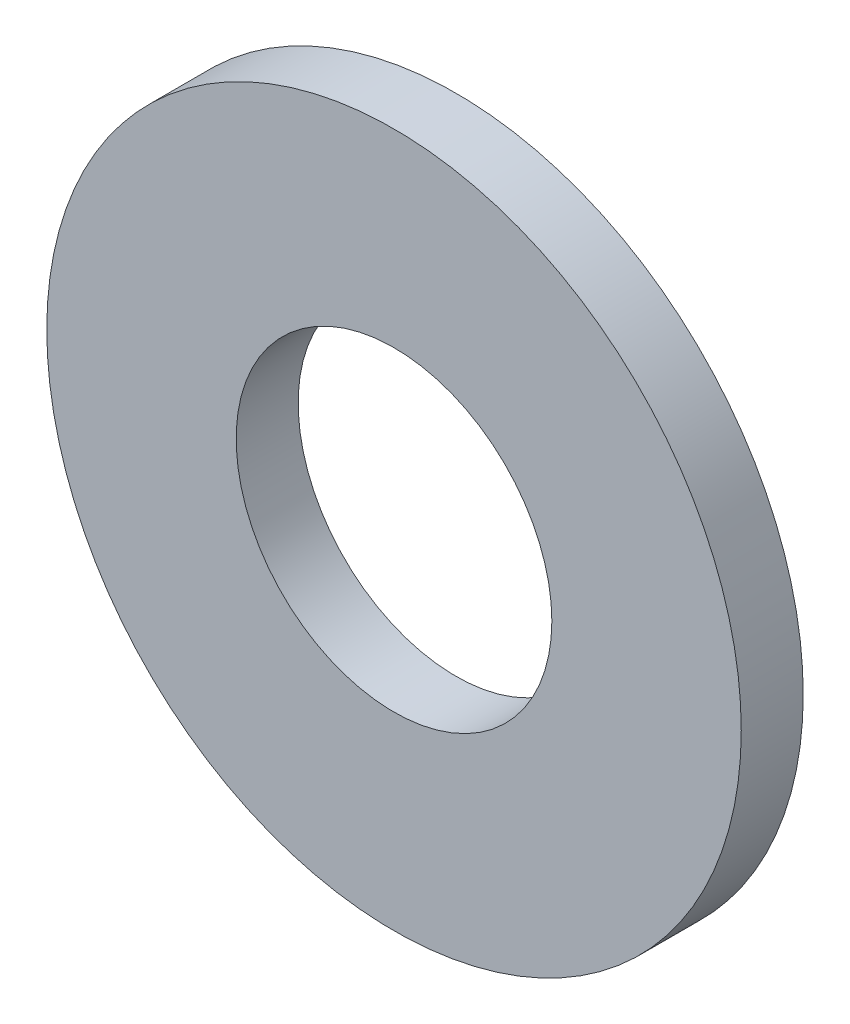
ISO-10303-21;
HEADER;
FILE_DESCRIPTION(('STEP AP214'),'2;1');
FILE_NAME('part.step','',(''),(''),'','','');
FILE_SCHEMA(('AUTOMOTIVE_DESIGN { 1 0 10303 214 1 1 1 1 }'));
ENDSEC;
DATA;
#1=APPLICATION_CONTEXT('core data for automotive mechanical design processes');
#2=APPLICATION_PROTOCOL_DEFINITION('international standard','automotive_design',2000,#1);
#3=PRODUCT_CONTEXT('',#1,'mechanical');
#4=PRODUCT('Part','Part','',(#3));
#5=PRODUCT_RELATED_PRODUCT_CATEGORY('part','',(#4));
#6=PRODUCT_DEFINITION_FORMATION('','',#4);
#7=PRODUCT_DEFINITION_CONTEXT('part definition',#1,'design');
#8=PRODUCT_DEFINITION('design','',#6,#7);
#9=PRODUCT_DEFINITION_SHAPE('','',#8);
#10=(LENGTH_UNIT() NAMED_UNIT(*) SI_UNIT(.MILLI.,.METRE.));
#11=(NAMED_UNIT(*) PLANE_ANGLE_UNIT() SI_UNIT($,.RADIAN.));
#12=(NAMED_UNIT(*) SI_UNIT($,.STERADIAN.) SOLID_ANGLE_UNIT());
#13=UNCERTAINTY_MEASURE_WITH_UNIT(LENGTH_MEASURE(1.E-05),#10,'distance_accuracy_value','');
#14=(GEOMETRIC_REPRESENTATION_CONTEXT(3) GLOBAL_UNCERTAINTY_ASSIGNED_CONTEXT((#13)) GLOBAL_UNIT_ASSIGNED_CONTEXT((#10,
#11,#12)) REPRESENTATION_CONTEXT('',''));
#15=CARTESIAN_POINT('',(0.,0.,0.));
#16=DIRECTION('',(0.,0.,1.));
#17=DIRECTION('',(1.,0.,0.));
#18=AXIS2_PLACEMENT_3D('',#15,#16,#17);
#19=CARTESIAN_POINT('',(0.,0.,4.7371));
#20=DIRECTION('',(0.,0.,1.));
#21=DIRECTION('',(1.,0.,0.));
#22=AXIS2_PLACEMENT_3D('',#19,#20,#21);
#23=PLANE('',#22);
#24=CARTESIAN_POINT('',(0.,0.,4.7371));
#25=DIRECTION('',(0.,0.,1.));
#26=DIRECTION('',(1.,0.,0.));
#27=AXIS2_PLACEMENT_3D('',#24,#25,#26);
#28=CIRCLE('',#27,26.543);
#29=CARTESIAN_POINT('',(26.543,0.,4.7371));
#30=VERTEX_POINT('',#29);
#31=EDGE_CURVE('E11',#30,#30,#28,.T.);
#32=ORIENTED_EDGE('',*,*,#31,.T.);
#33=EDGE_LOOP('',(#32));
#34=FACE_BOUND('',#33,.T.);
#35=CARTESIAN_POINT('',(0.,0.,4.7371));
#36=DIRECTION('',(0.,0.,1.));
#37=DIRECTION('',(1.,0.,0.));
#38=AXIS2_PLACEMENT_3D('',#35,#36,#37);
#39=CIRCLE('',#38,12.065);
#40=CARTESIAN_POINT('',(12.065,0.,4.7371));
#41=VERTEX_POINT('',#40);
#42=EDGE_CURVE('E60',#41,#41,#39,.T.);
#43=ORIENTED_EDGE('',*,*,#42,.F.);
#44=EDGE_LOOP('',(#43));
#45=FACE_BOUND('',#44,.T.);
#46=ADVANCED_FACE('F47',(#34,#45),#23,.T.);
#47=CARTESIAN_POINT('',(0.,0.,0.));
#48=DIRECTION('',(0.,0.,1.));
#49=DIRECTION('',(1.,0.,0.));
#50=AXIS2_PLACEMENT_3D('',#47,#48,#49);
#51=PLANE('',#50);
#52=CARTESIAN_POINT('',(0.,0.,0.));
#53=DIRECTION('',(0.,0.,1.));
#54=DIRECTION('',(1.,0.,0.));
#55=AXIS2_PLACEMENT_3D('',#52,#53,#54);
#56=CIRCLE('',#55,26.543);
#57=CARTESIAN_POINT('',(26.543,0.,0.));
#58=VERTEX_POINT('',#57);
#59=EDGE_CURVE('E51',#58,#58,#56,.T.);
#60=ORIENTED_EDGE('',*,*,#59,.F.);
#61=EDGE_LOOP('',(#60));
#62=FACE_BOUND('',#61,.T.);
#63=CARTESIAN_POINT('',(0.,0.,0.));
#64=DIRECTION('',(0.,0.,1.));
#65=DIRECTION('',(1.,0.,0.));
#66=AXIS2_PLACEMENT_3D('',#63,#64,#65);
#67=CIRCLE('',#66,12.065);
#68=CARTESIAN_POINT('',(12.065,0.,0.));
#69=VERTEX_POINT('',#68);
#70=EDGE_CURVE('E62',#69,#69,#67,.T.);
#71=ORIENTED_EDGE('',*,*,#70,.T.);
#72=EDGE_LOOP('',(#71));
#73=FACE_BOUND('',#72,.T.);
#74=ADVANCED_FACE('F74',(#62,#73),#51,.F.);
#75=CARTESIAN_POINT('',(0.,0.,4.7371));
#76=DIRECTION('',(0.,0.,-1.));
#77=DIRECTION('',(-1.,0.,0.));
#78=AXIS2_PLACEMENT_3D('',#75,#76,#77);
#79=CYLINDRICAL_SURFACE('',#78,26.543);
#80=ORIENTED_EDGE('',*,*,#31,.F.);
#81=EDGE_LOOP('',(#80));
#82=FACE_BOUND('',#81,.T.);
#83=ORIENTED_EDGE('',*,*,#59,.T.);
#84=EDGE_LOOP('',(#83));
#85=FACE_BOUND('',#84,.T.);
#86=ADVANCED_FACE('F49',(#82,#85),#79,.T.);
#87=CARTESIAN_POINT('',(0.,0.,4.7371));
#88=DIRECTION('',(0.,0.,-1.));
#89=DIRECTION('',(-1.,0.,0.));
#90=AXIS2_PLACEMENT_3D('',#87,#88,#89);
#91=CYLINDRICAL_SURFACE('',#90,12.065);
#92=ORIENTED_EDGE('',*,*,#42,.T.);
#93=EDGE_LOOP('',(#92));
#94=FACE_BOUND('',#93,.T.);
#95=ORIENTED_EDGE('',*,*,#70,.F.);
#96=EDGE_LOOP('',(#95));
#97=FACE_BOUND('',#96,.T.);
#98=ADVANCED_FACE('F70',(#94,#97),#91,.F.);
#99=CLOSED_SHELL('',(#46,#74,#86,#98));
#100=MANIFOLD_SOLID_BREP('B2',#99);
#101=ADVANCED_BREP_SHAPE_REPRESENTATION('',(#18,#100),#14);
#102=SHAPE_DEFINITION_REPRESENTATION(#9,#101);
ENDSEC;
END-ISO-10303-21;
